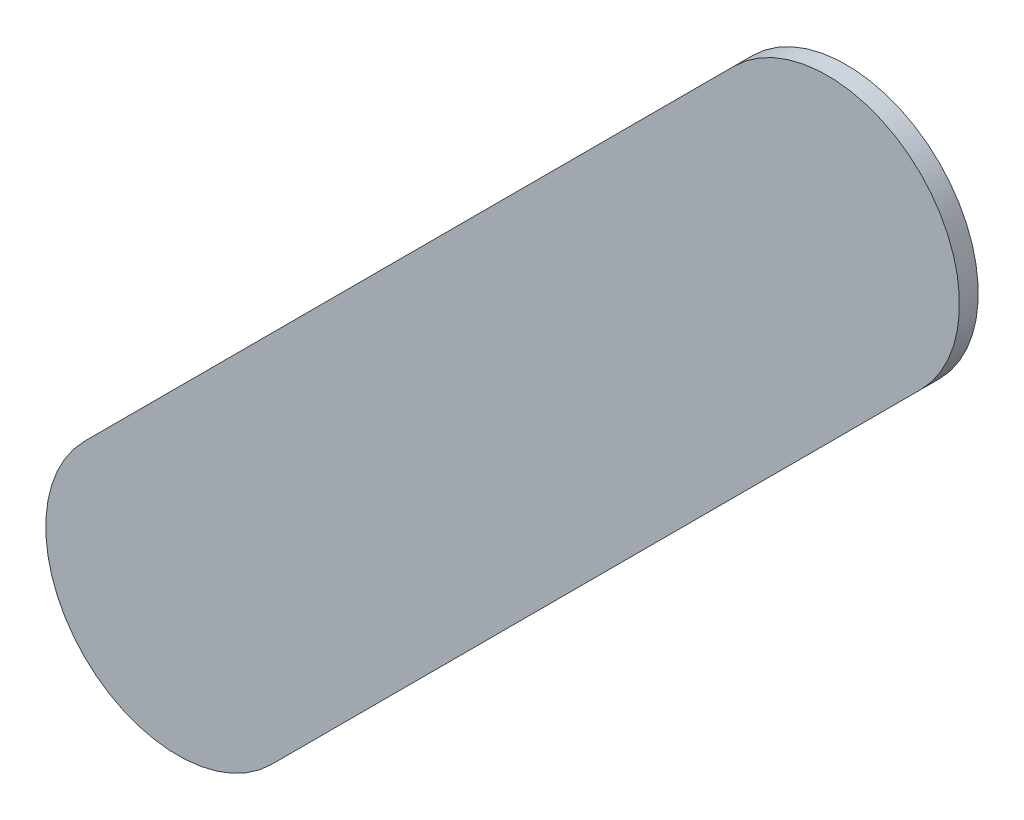
ISO-10303-21;
HEADER;
FILE_DESCRIPTION(('STEP AP214'),'2;1');
FILE_NAME('part.step','',(''),(''),'','','');
FILE_SCHEMA(('AUTOMOTIVE_DESIGN { 1 0 10303 214 1 1 1 1 }'));
ENDSEC;
DATA;
#1=APPLICATION_CONTEXT('core data for automotive mechanical design processes');
#2=APPLICATION_PROTOCOL_DEFINITION('international standard','automotive_design',2000,#1);
#3=PRODUCT_CONTEXT('',#1,'mechanical');
#4=PRODUCT('Part','Part','',(#3));
#5=PRODUCT_RELATED_PRODUCT_CATEGORY('part','',(#4));
#6=PRODUCT_DEFINITION_FORMATION('','',#4);
#7=PRODUCT_DEFINITION_CONTEXT('part definition',#1,'design');
#8=PRODUCT_DEFINITION('design','',#6,#7);
#9=PRODUCT_DEFINITION_SHAPE('','',#8);
#10=(LENGTH_UNIT() NAMED_UNIT(*) SI_UNIT(.MILLI.,.METRE.));
#11=(NAMED_UNIT(*) PLANE_ANGLE_UNIT() SI_UNIT($,.RADIAN.));
#12=(NAMED_UNIT(*) SI_UNIT($,.STERADIAN.) SOLID_ANGLE_UNIT());
#13=UNCERTAINTY_MEASURE_WITH_UNIT(LENGTH_MEASURE(1.E-05),#10,'distance_accuracy_value','');
#14=(GEOMETRIC_REPRESENTATION_CONTEXT(3) GLOBAL_UNCERTAINTY_ASSIGNED_CONTEXT((#13)) GLOBAL_UNIT_ASSIGNED_CONTEXT((#10,
#11,#12)) REPRESENTATION_CONTEXT('',''));
#15=CARTESIAN_POINT('',(0.,0.,0.));
#16=DIRECTION('',(0.,0.,1.));
#17=DIRECTION('',(1.,0.,0.));
#18=AXIS2_PLACEMENT_3D('',#15,#16,#17);
#19=CARTESIAN_POINT('',(89.07500854,109.2551409,0.));
#20=DIRECTION('',(-0.707106781186543,0.707106781186552,0.));
#21=DIRECTION('',(0.707106781186552,0.707106781186543,0.));
#22=AXIS2_PLACEMENT_3D('',#19,#20,#21);
#23=PLANE('',#22);
#24=DIRECTION('',(0.707106781186552,0.707106781186543,0.));
#25=VECTOR('',#24,1.);
#26=CARTESIAN_POINT('',(89.07500854,109.2551409,0.03556));
#27=LINE('',#26,#25);
#28=CARTESIAN_POINT('',(89.07500854,109.2551409,0.03556));
#29=VERTEX_POINT('',#28);
#30=CARTESIAN_POINT('',(90.3051026,110.48523496,0.03556));
#31=VERTEX_POINT('',#30);
#32=EDGE_CURVE('E11',#29,#31,#27,.T.);
#33=ORIENTED_EDGE('',*,*,#32,.F.);
#34=DIRECTION('',(0.,0.,1.));
#35=VECTOR('',#34,1.);
#36=CARTESIAN_POINT('',(89.07500854,109.2551409,0.));
#37=LINE('',#36,#35);
#38=CARTESIAN_POINT('',(89.07500854,109.2551409,0.));
#39=VERTEX_POINT('',#38);
#40=EDGE_CURVE('E24',#39,#29,#37,.T.);
#41=ORIENTED_EDGE('',*,*,#40,.F.);
#42=DIRECTION('',(0.707106781186552,0.707106781186543,0.));
#43=VECTOR('',#42,1.);
#44=CARTESIAN_POINT('',(89.07500854,109.2551409,0.));
#45=LINE('',#44,#43);
#46=CARTESIAN_POINT('',(90.3051026,110.48523496,0.));
#47=VERTEX_POINT('',#46);
#48=EDGE_CURVE('E75',#39,#47,#45,.T.);
#49=ORIENTED_EDGE('',*,*,#48,.T.);
#50=DIRECTION('',(0.,0.,1.));
#51=VECTOR('',#50,1.);
#52=CARTESIAN_POINT('',(90.3051026,110.48523496,0.));
#53=LINE('',#52,#51);
#54=EDGE_CURVE('E37',#47,#31,#53,.T.);
#55=ORIENTED_EDGE('',*,*,#54,.T.);
#56=EDGE_LOOP('',(#33,#41,#49,#55));
#57=FACE_BOUND('',#56,.T.);
#58=ADVANCED_FACE('F17',(#57),#23,.F.);
#59=CARTESIAN_POINT('',(90.12832622,110.66201134,0.));
#60=DIRECTION('',(0.,0.,-1.));
#61=DIRECTION('',(0.707106781186548,-0.707106781186548,0.));
#62=AXIS2_PLACEMENT_3D('',#59,#60,#61);
#63=CYLINDRICAL_SURFACE('',#62,0.249999554103226);
#64=CARTESIAN_POINT('',(90.12832622,110.66201134,0.03556));
#65=DIRECTION('',(0.,0.,1.));
#66=DIRECTION('',(0.707106781186548,-0.707106781186548,0.));
#67=AXIS2_PLACEMENT_3D('',#64,#65,#66);
#68=CIRCLE('',#67,0.249999554103226);
#69=CARTESIAN_POINT('',(89.95154984,110.83878772,0.03556));
#70=VERTEX_POINT('',#69);
#71=EDGE_CURVE('E83',#31,#70,#68,.T.);
#72=ORIENTED_EDGE('',*,*,#71,.F.);
#73=ORIENTED_EDGE('',*,*,#54,.F.);
#74=CARTESIAN_POINT('',(90.12832622,110.66201134,0.));
#75=DIRECTION('',(0.,0.,1.));
#76=DIRECTION('',(0.707106781186548,-0.707106781186548,0.));
#77=AXIS2_PLACEMENT_3D('',#74,#75,#76);
#78=CIRCLE('',#77,0.249999554103226);
#79=CARTESIAN_POINT('',(89.95154984,110.83878772,0.));
#80=VERTEX_POINT('',#79);
#81=EDGE_CURVE('E81',#47,#80,#78,.T.);
#82=ORIENTED_EDGE('',*,*,#81,.T.);
#83=DIRECTION('',(0.,0.,1.));
#84=VECTOR('',#83,1.);
#85=CARTESIAN_POINT('',(89.95154984,110.83878772,0.));
#86=LINE('',#85,#84);
#87=EDGE_CURVE('E67',#80,#70,#86,.T.);
#88=ORIENTED_EDGE('',*,*,#87,.T.);
#89=EDGE_LOOP('',(#72,#73,#82,#88));
#90=FACE_BOUND('',#89,.T.);
#91=ADVANCED_FACE('F89',(#90),#63,.T.);
#92=CARTESIAN_POINT('',(89.95154984,110.83878772,0.));
#93=DIRECTION('',(0.707106781186552,-0.707106781186543,0.));
#94=DIRECTION('',(-0.707106781186543,-0.707106781186552,0.));
#95=AXIS2_PLACEMENT_3D('',#92,#93,#94);
#96=PLANE('',#95);
#97=DIRECTION('',(-0.707106781186543,-0.707106781186552,0.));
#98=VECTOR('',#97,1.);
#99=CARTESIAN_POINT('',(89.95154984,110.83878772,0.03556));
#100=LINE('',#99,#98);
#101=CARTESIAN_POINT('',(88.72145578,109.60869366,0.03556));
#102=VERTEX_POINT('',#101);
#103=EDGE_CURVE('E71',#70,#102,#100,.T.);
#104=ORIENTED_EDGE('',*,*,#103,.F.);
#105=ORIENTED_EDGE('',*,*,#87,.F.);
#106=DIRECTION('',(-0.707106781186543,-0.707106781186552,0.));
#107=VECTOR('',#106,1.);
#108=CARTESIAN_POINT('',(89.95154984,110.83878772,0.));
#109=LINE('',#108,#107);
#110=CARTESIAN_POINT('',(88.72145578,109.60869366,0.));
#111=VERTEX_POINT('',#110);
#112=EDGE_CURVE('E63',#80,#111,#109,.T.);
#113=ORIENTED_EDGE('',*,*,#112,.T.);
#114=DIRECTION('',(0.,0.,1.));
#115=VECTOR('',#114,1.);
#116=CARTESIAN_POINT('',(88.72145578,109.60869366,0.));
#117=LINE('',#116,#115);
#118=EDGE_CURVE('E53',#111,#102,#117,.T.);
#119=ORIENTED_EDGE('',*,*,#118,.T.);
#120=EDGE_LOOP('',(#104,#105,#113,#119));
#121=FACE_BOUND('',#120,.T.);
#122=ADVANCED_FACE('F66',(#121),#96,.F.);
#123=CARTESIAN_POINT('',(88.89823216,109.43191728,0.));
#124=DIRECTION('',(0.,0.,-1.));
#125=DIRECTION('',(-0.707106781186548,0.707106781186548,0.));
#126=AXIS2_PLACEMENT_3D('',#123,#124,#125);
#127=CYLINDRICAL_SURFACE('',#126,0.249999554103213);
#128=CARTESIAN_POINT('',(88.89823216,109.43191728,0.03556));
#129=DIRECTION('',(0.,0.,1.));
#130=DIRECTION('',(-0.707106781186548,0.707106781186548,0.));
#131=AXIS2_PLACEMENT_3D('',#128,#129,#130);
#132=CIRCLE('',#131,0.249999554103213);
#133=EDGE_CURVE('E59',#102,#29,#132,.T.);
#134=ORIENTED_EDGE('',*,*,#133,.F.);
#135=ORIENTED_EDGE('',*,*,#118,.F.);
#136=CARTESIAN_POINT('',(88.89823216,109.43191728,0.));
#137=DIRECTION('',(0.,0.,1.));
#138=DIRECTION('',(-0.707106781186548,0.707106781186548,0.));
#139=AXIS2_PLACEMENT_3D('',#136,#137,#138);
#140=CIRCLE('',#139,0.249999554103213);
#141=EDGE_CURVE('E57',#111,#39,#140,.T.);
#142=ORIENTED_EDGE('',*,*,#141,.T.);
#143=ORIENTED_EDGE('',*,*,#40,.T.);
#144=EDGE_LOOP('',(#134,#135,#142,#143));
#145=FACE_BOUND('',#144,.T.);
#146=ADVANCED_FACE('F55',(#145),#127,.T.);
#147=CARTESIAN_POINT('',(89.07500854,109.2551409,0.));
#148=DIRECTION('',(0.,0.,-1.));
#149=DIRECTION('',(-1.,0.,0.));
#150=AXIS2_PLACEMENT_3D('',#147,#148,#149);
#151=PLANE('',#150);
#152=ORIENTED_EDGE('',*,*,#141,.F.);
#153=ORIENTED_EDGE('',*,*,#112,.F.);
#154=ORIENTED_EDGE('',*,*,#81,.F.);
#155=ORIENTED_EDGE('',*,*,#48,.F.);
#156=EDGE_LOOP('',(#152,#153,#154,#155));
#157=FACE_BOUND('',#156,.T.);
#158=ADVANCED_FACE('F74',(#157),#151,.T.);
#159=CARTESIAN_POINT('',(89.07500854,109.2551409,0.03556));
#160=DIRECTION('',(0.,0.,-1.));
#161=DIRECTION('',(-1.,0.,0.));
#162=AXIS2_PLACEMENT_3D('',#159,#160,#161);
#163=PLANE('',#162);
#164=ORIENTED_EDGE('',*,*,#32,.T.);
#165=ORIENTED_EDGE('',*,*,#71,.T.);
#166=ORIENTED_EDGE('',*,*,#103,.T.);
#167=ORIENTED_EDGE('',*,*,#133,.T.);
#168=EDGE_LOOP('',(#164,#165,#166,#167));
#169=FACE_BOUND('',#168,.T.);
#170=ADVANCED_FACE('F91',(#169),#163,.F.);
#171=CLOSED_SHELL('',(#58,#91,#122,#146,#158,#170));
#172=MANIFOLD_SOLID_BREP('B1',#171);
#173=ADVANCED_BREP_SHAPE_REPRESENTATION('',(#18,#172),#14);
#174=SHAPE_DEFINITION_REPRESENTATION(#9,#173);
ENDSEC;
END-ISO-10303-21;
